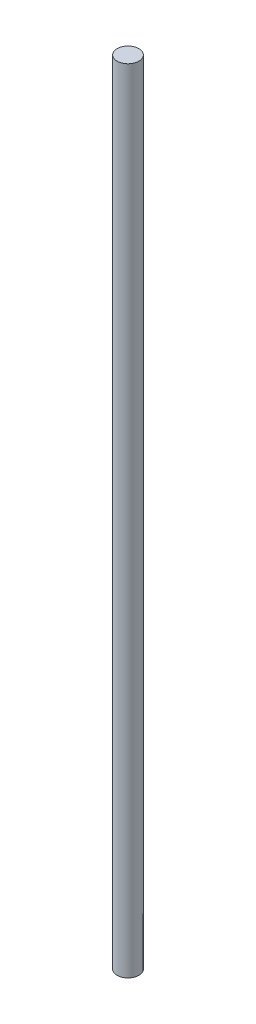
ISO-10303-21;
HEADER;
FILE_DESCRIPTION(('STEP AP214'),'2;1');
FILE_NAME('part.step','',(''),(''),'','','');
FILE_SCHEMA(('AUTOMOTIVE_DESIGN { 1 0 10303 214 1 1 1 1 }'));
ENDSEC;
DATA;
#1=APPLICATION_CONTEXT('core data for automotive mechanical design processes');
#2=APPLICATION_PROTOCOL_DEFINITION('international standard','automotive_design',2000,#1);
#3=PRODUCT_CONTEXT('',#1,'mechanical');
#4=PRODUCT('Part','Part','',(#3));
#5=PRODUCT_RELATED_PRODUCT_CATEGORY('part','',(#4));
#6=PRODUCT_DEFINITION_FORMATION('','',#4);
#7=PRODUCT_DEFINITION_CONTEXT('part definition',#1,'design');
#8=PRODUCT_DEFINITION('design','',#6,#7);
#9=PRODUCT_DEFINITION_SHAPE('','',#8);
#10=(LENGTH_UNIT() NAMED_UNIT(*) SI_UNIT(.MILLI.,.METRE.));
#11=(NAMED_UNIT(*) PLANE_ANGLE_UNIT() SI_UNIT($,.RADIAN.));
#12=(NAMED_UNIT(*) SI_UNIT($,.STERADIAN.) SOLID_ANGLE_UNIT());
#13=UNCERTAINTY_MEASURE_WITH_UNIT(LENGTH_MEASURE(1.E-05),#10,'distance_accuracy_value','');
#14=(GEOMETRIC_REPRESENTATION_CONTEXT(3) GLOBAL_UNCERTAINTY_ASSIGNED_CONTEXT((#13)) GLOBAL_UNIT_ASSIGNED_CONTEXT((#10,
#11,#12)) REPRESENTATION_CONTEXT('',''));
#15=CARTESIAN_POINT('',(0.,0.,0.));
#16=DIRECTION('',(0.,0.,1.));
#17=DIRECTION('',(1.,0.,0.));
#18=AXIS2_PLACEMENT_3D('',#15,#16,#17);
#19=CARTESIAN_POINT('',(0.,800.,0.));
#20=DIRECTION('',(0.,-1.,0.));
#21=DIRECTION('',(0.,0.,-1.));
#22=AXIS2_PLACEMENT_3D('',#19,#20,#21);
#23=CYLINDRICAL_SURFACE('',#22,11.);
#24=CARTESIAN_POINT('',(0.,800.,0.));
#25=DIRECTION('',(0.,1.,0.));
#26=DIRECTION('',(0.,0.,1.));
#27=AXIS2_PLACEMENT_3D('',#24,#25,#26);
#28=CIRCLE('',#27,11.);
#29=CARTESIAN_POINT('',(0.,800.,11.));
#30=VERTEX_POINT('',#29);
#31=EDGE_CURVE('E10',#30,#30,#28,.T.);
#32=ORIENTED_EDGE('',*,*,#31,.F.);
#33=EDGE_LOOP('',(#32));
#34=FACE_BOUND('',#33,.T.);
#35=CARTESIAN_POINT('',(0.,0.,0.));
#36=DIRECTION('',(0.,1.,0.));
#37=DIRECTION('',(0.,0.,1.));
#38=AXIS2_PLACEMENT_3D('',#35,#36,#37);
#39=CIRCLE('',#38,11.);
#40=CARTESIAN_POINT('',(0.,0.,11.));
#41=VERTEX_POINT('',#40);
#42=EDGE_CURVE('E33',#41,#41,#39,.T.);
#43=ORIENTED_EDGE('',*,*,#42,.T.);
#44=EDGE_LOOP('',(#43));
#45=FACE_BOUND('',#44,.T.);
#46=ADVANCED_FACE('F30',(#34,#45),#23,.T.);
#47=CARTESIAN_POINT('',(0.,800.,0.));
#48=DIRECTION('',(0.,1.,0.));
#49=DIRECTION('',(0.,0.,1.));
#50=AXIS2_PLACEMENT_3D('',#47,#48,#49);
#51=PLANE('',#50);
#52=ORIENTED_EDGE('',*,*,#31,.T.);
#53=EDGE_LOOP('',(#52));
#54=FACE_BOUND('',#53,.T.);
#55=ADVANCED_FACE('F45',(#54),#51,.T.);
#56=CARTESIAN_POINT('',(0.,0.,0.));
#57=DIRECTION('',(0.,1.,0.));
#58=DIRECTION('',(0.,0.,1.));
#59=AXIS2_PLACEMENT_3D('',#56,#57,#58);
#60=PLANE('',#59);
#61=ORIENTED_EDGE('',*,*,#42,.F.);
#62=EDGE_LOOP('',(#61));
#63=FACE_BOUND('',#62,.T.);
#64=ADVANCED_FACE('F43',(#63),#60,.F.);
#65=CLOSED_SHELL('',(#46,#55,#64));
#66=MANIFOLD_SOLID_BREP('B2',#65);
#67=ADVANCED_BREP_SHAPE_REPRESENTATION('',(#18,#66),#14);
#68=SHAPE_DEFINITION_REPRESENTATION(#9,#67);
ENDSEC;
END-ISO-10303-21;
